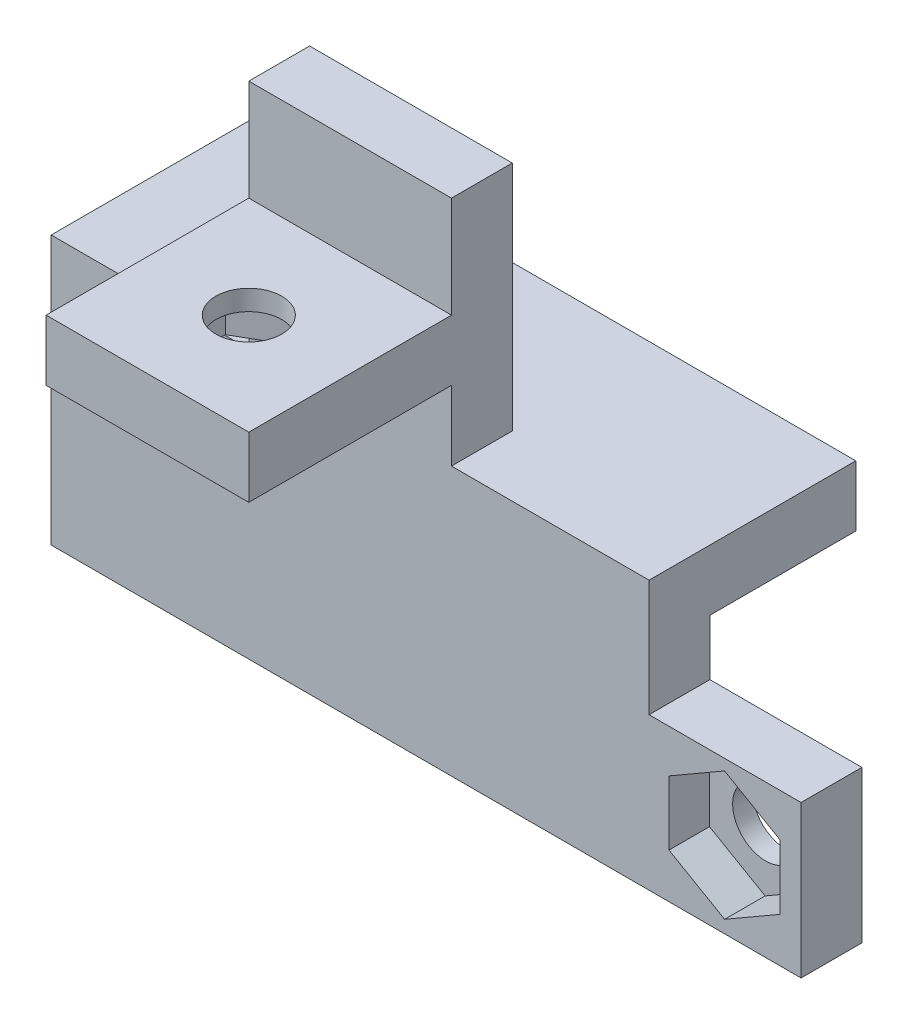
ISO-10303-21;
HEADER;
FILE_DESCRIPTION(('STEP AP214'),'2;1');
FILE_NAME('part.step','',(''),(''),'','','');
FILE_SCHEMA(('AUTOMOTIVE_DESIGN { 1 0 10303 214 1 1 1 1 }'));
ENDSEC;
DATA;
#1=APPLICATION_CONTEXT('core data for automotive mechanical design processes');
#2=APPLICATION_PROTOCOL_DEFINITION('international standard','automotive_design',2000,#1);
#3=PRODUCT_CONTEXT('',#1,'mechanical');
#4=PRODUCT('Part','Part','',(#3));
#5=PRODUCT_RELATED_PRODUCT_CATEGORY('part','',(#4));
#6=PRODUCT_DEFINITION_FORMATION('','',#4);
#7=PRODUCT_DEFINITION_CONTEXT('part definition',#1,'design');
#8=PRODUCT_DEFINITION('design','',#6,#7);
#9=PRODUCT_DEFINITION_SHAPE('','',#8);
#10=(LENGTH_UNIT() NAMED_UNIT(*) SI_UNIT(.MILLI.,.METRE.));
#11=(NAMED_UNIT(*) PLANE_ANGLE_UNIT() SI_UNIT($,.RADIAN.));
#12=(NAMED_UNIT(*) SI_UNIT($,.STERADIAN.) SOLID_ANGLE_UNIT());
#13=UNCERTAINTY_MEASURE_WITH_UNIT(LENGTH_MEASURE(1.E-05),#10,'distance_accuracy_value','');
#14=(GEOMETRIC_REPRESENTATION_CONTEXT(3) GLOBAL_UNCERTAINTY_ASSIGNED_CONTEXT((#13)) GLOBAL_UNIT_ASSIGNED_CONTEXT((#10,
#11,#12)) REPRESENTATION_CONTEXT('',''));
#15=CARTESIAN_POINT('',(0.,0.,0.));
#16=DIRECTION('',(0.,0.,1.));
#17=DIRECTION('',(1.,0.,0.));
#18=AXIS2_PLACEMENT_3D('',#15,#16,#17);
#19=CARTESIAN_POINT('',(-62.7088413646962,-5.00000000000036,8.));
#20=DIRECTION('',(0.,-1.,0.));
#21=DIRECTION('',(0.,0.,-1.));
#22=AXIS2_PLACEMENT_3D('',#19,#20,#21);
#23=CYLINDRICAL_SURFACE('',#22,1.625);
#24=CARTESIAN_POINT('',(-62.7088413646962,-5.00000000000036,8.));
#25=DIRECTION('',(0.,-1.,0.));
#26=DIRECTION('',(0.,0.,-1.));
#27=AXIS2_PLACEMENT_3D('',#24,#25,#26);
#28=CIRCLE('',#27,1.625);
#29=CARTESIAN_POINT('',(-62.7088413646962,-5.00000000000036,6.375));
#30=VERTEX_POINT('',#29);
#31=EDGE_CURVE('E274',#30,#30,#28,.T.);
#32=ORIENTED_EDGE('',*,*,#31,.F.);
#33=EDGE_LOOP('',(#32));
#34=FACE_BOUND('',#33,.T.);
#35=CARTESIAN_POINT('',(-62.7088413646962,-6.00000000000036,8.));
#36=DIRECTION('',(0.,-1.,0.));
#37=DIRECTION('',(0.,0.,-1.));
#38=AXIS2_PLACEMENT_3D('',#35,#36,#37);
#39=CIRCLE('',#38,1.625);
#40=CARTESIAN_POINT('',(-62.7088413646962,-6.00000000000036,6.375));
#41=VERTEX_POINT('',#40);
#42=EDGE_CURVE('E36',#41,#41,#39,.F.);
#43=ORIENTED_EDGE('',*,*,#42,.F.);
#44=EDGE_LOOP('',(#43));
#45=FACE_BOUND('',#44,.T.);
#46=ADVANCED_FACE('F32',(#34,#45),#23,.F.);
#47=CARTESIAN_POINT('',(0.,0.,3.));
#48=DIRECTION('',(0.,0.,1.));
#49=DIRECTION('',(1.,0.,0.));
#50=AXIS2_PLACEMENT_3D('',#47,#48,#49);
#51=PLANE('',#50);
#52=DIRECTION('',(1.,0.,0.));
#53=VECTOR('',#52,1.);
#54=CARTESIAN_POINT('',(-57.7088413646962,-8.00000000000036,3.));
#55=LINE('',#54,#53);
#56=CARTESIAN_POINT('',(-67.7088413646962,-8.00000000000036,3.));
#57=VERTEX_POINT('',#56);
#58=CARTESIAN_POINT('',(-57.7088413646962,-8.00000000000036,3.));
#59=VERTEX_POINT('',#58);
#60=EDGE_CURVE('E57',#57,#59,#55,.T.);
#61=ORIENTED_EDGE('',*,*,#60,.F.);
#62=DIRECTION('',(0.,-1.,0.));
#63=VECTOR('',#62,1.);
#64=CARTESIAN_POINT('',(-67.7088413646962,-5.00000000000036,3.));
#65=LINE('',#64,#63);
#66=CARTESIAN_POINT('',(-67.7088413646962,-11.4500000000005,3.));
#67=VERTEX_POINT('',#66);
#68=EDGE_CURVE('E327',#57,#67,#65,.T.);
#69=ORIENTED_EDGE('',*,*,#68,.T.);
#70=DIRECTION('',(1.,0.,0.));
#71=VECTOR('',#70,1.);
#72=CARTESIAN_POINT('',(-47.958841364696,-11.4500000000003,3.));
#73=LINE('',#72,#71);
#74=CARTESIAN_POINT('',(-77.4588413646964,-11.4500000000005,3.));
#75=VERTEX_POINT('',#74);
#76=EDGE_CURVE('E340',#75,#67,#73,.T.);
#77=ORIENTED_EDGE('',*,*,#76,.F.);
#78=DIRECTION('',(0.,-1.,0.));
#79=VECTOR('',#78,1.);
#80=CARTESIAN_POINT('',(-77.4588413646959,-24.7000000000005,3.));
#81=LINE('',#80,#79);
#82=CARTESIAN_POINT('',(-77.4588413646959,-24.7000000000005,3.));
#83=VERTEX_POINT('',#82);
#84=EDGE_CURVE('E420',#75,#83,#81,.T.);
#85=ORIENTED_EDGE('',*,*,#84,.T.);
#86=DIRECTION('',(1.,0.,0.));
#87=VECTOR('',#86,1.);
#88=CARTESIAN_POINT('',(-40.4588413646959,-24.7000000000014,3.));
#89=LINE('',#88,#87);
#90=CARTESIAN_POINT('',(-40.4588413646959,-24.7000000000014,3.));
#91=VERTEX_POINT('',#90);
#92=EDGE_CURVE('E422',#83,#91,#89,.T.);
#93=ORIENTED_EDGE('',*,*,#92,.T.);
#94=DIRECTION('',(0.,1.,0.));
#95=VECTOR('',#94,1.);
#96=CARTESIAN_POINT('',(-40.4588413646959,-24.7000000000014,3.));
#97=LINE('',#96,#95);
#98=CARTESIAN_POINT('',(-40.4588413646959,-17.2000000000014,3.));
#99=VERTEX_POINT('',#98);
#100=EDGE_CURVE('E411',#91,#99,#97,.T.);
#101=ORIENTED_EDGE('',*,*,#100,.T.);
#102=DIRECTION('',(-1.,0.,0.));
#103=VECTOR('',#102,1.);
#104=CARTESIAN_POINT('',(-40.4588413646959,-17.2000000000014,3.));
#105=LINE('',#104,#103);
#106=CARTESIAN_POINT('',(-47.958841364696,-17.2000000000014,3.));
#107=VERTEX_POINT('',#106);
#108=EDGE_CURVE('E414',#99,#107,#105,.T.);
#109=ORIENTED_EDGE('',*,*,#108,.T.);
#110=DIRECTION('',(0.,1.,0.));
#111=VECTOR('',#110,1.);
#112=CARTESIAN_POINT('',(-47.958841364696,-17.2000000000014,3.));
#113=LINE('',#112,#111);
#114=CARTESIAN_POINT('',(-47.958841364696,-11.4500000000003,3.));
#115=VERTEX_POINT('',#114);
#116=EDGE_CURVE('E417',#107,#115,#113,.T.);
#117=ORIENTED_EDGE('',*,*,#116,.T.);
#118=CARTESIAN_POINT('',(-57.7088413646962,-11.4500000000004,3.));
#119=VERTEX_POINT('',#118);
#120=EDGE_CURVE('E338',#119,#115,#73,.T.);
#121=ORIENTED_EDGE('',*,*,#120,.F.);
#122=DIRECTION('',(0.,1.,0.));
#123=VECTOR('',#122,1.);
#124=CARTESIAN_POINT('',(-57.7088413646962,-11.4500000000005,3.));
#125=LINE('',#124,#123);
#126=EDGE_CURVE('E325',#119,#59,#125,.T.);
#127=ORIENTED_EDGE('',*,*,#126,.T.);
#128=EDGE_LOOP('',(#61,#69,#77,#85,#93,#101,#109,#117,#121,#127));
#129=FACE_BOUND('',#128,.T.);
#130=DIRECTION('',(-0.866025403784438,0.500000000000001,0.));
#131=VECTOR('',#130,1.);
#132=CARTESIAN_POINT('',(-41.4871923916485,-19.3240343016862,3.));
#133=LINE('',#132,#131);
#134=CARTESIAN_POINT('',(-41.4871923916485,-19.3240343016862,3.));
#135=VERTEX_POINT('',#134);
#136=CARTESIAN_POINT('',(-44.2324929216451,-17.7390343016861,3.));
#137=VERTEX_POINT('',#136);
#138=EDGE_CURVE('E358',#135,#137,#133,.T.);
#139=ORIENTED_EDGE('',*,*,#138,.F.);
#140=DIRECTION('',(0.,1.,0.));
#141=VECTOR('',#140,1.);
#142=CARTESIAN_POINT('',(-41.4871923916485,-22.4940343016861,3.));
#143=LINE('',#142,#141);
#144=CARTESIAN_POINT('',(-41.4871923916485,-22.4940343016861,3.));
#145=VERTEX_POINT('',#144);
#146=EDGE_CURVE('E363',#145,#135,#143,.T.);
#147=ORIENTED_EDGE('',*,*,#146,.F.);
#148=DIRECTION('',(0.866025403784439,0.5,0.));
#149=VECTOR('',#148,1.);
#150=CARTESIAN_POINT('',(-44.2324929216451,-24.0790343016861,3.));
#151=LINE('',#150,#149);
#152=CARTESIAN_POINT('',(-44.2324929216451,-24.0790343016861,3.));
#153=VERTEX_POINT('',#152);
#154=EDGE_CURVE('E389',#153,#145,#151,.T.);
#155=ORIENTED_EDGE('',*,*,#154,.F.);
#156=DIRECTION('',(0.866025403784439,-0.5,0.));
#157=VECTOR('',#156,1.);
#158=CARTESIAN_POINT('',(-46.9777934516418,-22.4940343016861,3.));
#159=LINE('',#158,#157);
#160=CARTESIAN_POINT('',(-46.9777934516418,-22.4940343016861,3.));
#161=VERTEX_POINT('',#160);
#162=EDGE_CURVE('E386',#161,#153,#159,.T.);
#163=ORIENTED_EDGE('',*,*,#162,.F.);
#164=DIRECTION('',(0.,-1.,0.));
#165=VECTOR('',#164,1.);
#166=CARTESIAN_POINT('',(-46.9777934516418,-19.3240343016861,3.));
#167=LINE('',#166,#165);
#168=CARTESIAN_POINT('',(-46.9777934516418,-19.3240343016861,3.));
#169=VERTEX_POINT('',#168);
#170=EDGE_CURVE('E383',#169,#161,#167,.T.);
#171=ORIENTED_EDGE('',*,*,#170,.F.);
#172=DIRECTION('',(-0.86602540378444,-0.499999999999998,0.));
#173=VECTOR('',#172,1.);
#174=CARTESIAN_POINT('',(-44.2324929216451,-17.7390343016862,3.));
#175=LINE('',#174,#173);
#176=EDGE_CURVE('E380',#137,#169,#175,.T.);
#177=ORIENTED_EDGE('',*,*,#176,.F.);
#178=EDGE_LOOP('',(#139,#147,#155,#163,#171,#177));
#179=FACE_BOUND('',#178,.T.);
#180=ADVANCED_FACE('F478',(#129,#179),#51,.T.);
#181=CARTESIAN_POINT('',(-44.2088413646959,-20.9500000000014,3.));
#182=DIRECTION('',(0.,0.,-1.));
#183=DIRECTION('',(-1.,0.,0.));
#184=AXIS2_PLACEMENT_3D('',#181,#182,#183);
#185=CYLINDRICAL_SURFACE('',#184,1.62500000000032);
#186=CARTESIAN_POINT('',(-44.2088413646959,-20.9500000000014,0.));
#187=DIRECTION('',(0.,0.,1.));
#188=DIRECTION('',(1.,0.,0.));
#189=AXIS2_PLACEMENT_3D('',#186,#187,#188);
#190=CIRCLE('',#189,1.62500000000032);
#191=CARTESIAN_POINT('',(-42.5838413646956,-20.9500000000014,0.));
#192=VERTEX_POINT('',#191);
#193=EDGE_CURVE('E407',#192,#192,#190,.T.);
#194=ORIENTED_EDGE('',*,*,#193,.F.);
#195=EDGE_LOOP('',(#194));
#196=FACE_BOUND('',#195,.T.);
#197=CARTESIAN_POINT('',(-44.2088413646959,-20.9500000000014,1.));
#198=DIRECTION('',(0.,0.,1.));
#199=DIRECTION('',(1.,0.,0.));
#200=AXIS2_PLACEMENT_3D('',#197,#198,#199);
#201=CIRCLE('',#200,1.62500000000032);
#202=CARTESIAN_POINT('',(-42.5838413646956,-20.9500000000014,1.));
#203=VERTEX_POINT('',#202);
#204=EDGE_CURVE('E396',#203,#203,#201,.T.);
#205=ORIENTED_EDGE('',*,*,#204,.T.);
#206=EDGE_LOOP('',(#205));
#207=FACE_BOUND('',#206,.T.);
#208=ADVANCED_FACE('F446',(#196,#207),#185,.F.);
#209=DIRECTION('',(-1.,0.,0.));
#210=VECTOR('',#209,1.);
#211=CARTESIAN_POINT('',(-67.7088413646962,-5.00000000000036,3.));
#212=LINE('',#211,#210);
#213=CARTESIAN_POINT('',(-57.7088413646962,-5.00000000000036,3.));
#214=VERTEX_POINT('',#213);
#215=CARTESIAN_POINT('',(-67.7088413646962,-5.00000000000036,3.));
#216=VERTEX_POINT('',#215);
#217=EDGE_CURVE('E281',#214,#216,#212,.T.);
#218=ORIENTED_EDGE('',*,*,#217,.F.);
#219=CARTESIAN_POINT('',(-57.7088413646962,0.,3.));
#220=VERTEX_POINT('',#219);
#221=EDGE_CURVE('E314',#214,#220,#125,.T.);
#222=ORIENTED_EDGE('',*,*,#221,.T.);
#223=DIRECTION('',(1.,0.,0.));
#224=VECTOR('',#223,1.);
#225=CARTESIAN_POINT('',(-67.7088413646962,0.,3.));
#226=LINE('',#225,#224);
#227=CARTESIAN_POINT('',(-67.7088413646962,0.,3.));
#228=VERTEX_POINT('',#227);
#229=EDGE_CURVE('E305',#228,#220,#226,.T.);
#230=ORIENTED_EDGE('',*,*,#229,.F.);
#231=EDGE_CURVE('E319',#228,#216,#65,.T.);
#232=ORIENTED_EDGE('',*,*,#231,.T.);
#233=EDGE_LOOP('',(#218,#222,#230,#232));
#234=FACE_BOUND('',#233,.T.);
#235=ADVANCED_FACE('F481',(#234),#51,.T.);
#236=CARTESIAN_POINT('',(0.,0.,0.));
#237=DIRECTION('',(0.,0.,1.));
#238=DIRECTION('',(1.,0.,0.));
#239=AXIS2_PLACEMENT_3D('',#236,#237,#238);
#240=PLANE('',#239);
#241=DIRECTION('',(0.,1.,0.));
#242=VECTOR('',#241,1.);
#243=CARTESIAN_POINT('',(-40.4588413646959,-24.7000000000014,0.));
#244=LINE('',#243,#242);
#245=CARTESIAN_POINT('',(-40.4588413646959,-24.7000000000014,0.));
#246=VERTEX_POINT('',#245);
#247=CARTESIAN_POINT('',(-40.4588413646959,-17.2000000000014,0.));
#248=VERTEX_POINT('',#247);
#249=EDGE_CURVE('E410',#246,#248,#244,.T.);
#250=ORIENTED_EDGE('',*,*,#249,.F.);
#251=DIRECTION('',(1.,0.,0.));
#252=VECTOR('',#251,1.);
#253=CARTESIAN_POINT('',(-40.4588413646959,-24.7000000000014,0.));
#254=LINE('',#253,#252);
#255=CARTESIAN_POINT('',(-77.4588413646959,-24.7000000000005,0.));
#256=VERTEX_POINT('',#255);
#257=EDGE_CURVE('E415',#256,#246,#254,.T.);
#258=ORIENTED_EDGE('',*,*,#257,.F.);
#259=DIRECTION('',(0.,-1.,0.));
#260=VECTOR('',#259,1.);
#261=CARTESIAN_POINT('',(-77.4588413646959,-24.7000000000005,0.));
#262=LINE('',#261,#260);
#263=CARTESIAN_POINT('',(-77.4588413646964,-14.4500000000005,0.));
#264=VERTEX_POINT('',#263);
#265=EDGE_CURVE('E434',#264,#256,#262,.T.);
#266=ORIENTED_EDGE('',*,*,#265,.F.);
#267=DIRECTION('',(-1.,0.,0.));
#268=VECTOR('',#267,1.);
#269=CARTESIAN_POINT('',(-77.458841364696,-14.4500000000005,0.));
#270=LINE('',#269,#268);
#271=CARTESIAN_POINT('',(-47.958841364696,-14.4500000000003,0.));
#272=VERTEX_POINT('',#271);
#273=EDGE_CURVE('E431',#272,#264,#270,.T.);
#274=ORIENTED_EDGE('',*,*,#273,.F.);
#275=DIRECTION('',(0.,1.,0.));
#276=VECTOR('',#275,1.);
#277=CARTESIAN_POINT('',(-47.958841364696,-17.2000000000014,0.));
#278=LINE('',#277,#276);
#279=CARTESIAN_POINT('',(-47.958841364696,-17.2000000000014,0.));
#280=VERTEX_POINT('',#279);
#281=EDGE_CURVE('E429',#280,#272,#278,.T.);
#282=ORIENTED_EDGE('',*,*,#281,.F.);
#283=DIRECTION('',(-1.,0.,0.));
#284=VECTOR('',#283,1.);
#285=CARTESIAN_POINT('',(-40.4588413646959,-17.2000000000014,0.));
#286=LINE('',#285,#284);
#287=EDGE_CURVE('E427',#248,#280,#286,.T.);
#288=ORIENTED_EDGE('',*,*,#287,.F.);
#289=EDGE_LOOP('',(#250,#258,#266,#274,#282,#288));
#290=FACE_BOUND('',#289,.T.);
#291=ORIENTED_EDGE('',*,*,#193,.T.);
#292=EDGE_LOOP('',(#291));
#293=FACE_BOUND('',#292,.T.);
#294=ADVANCED_FACE('F492',(#290,#293),#240,.F.);
#295=CARTESIAN_POINT('',(-40.4588413646959,-24.7000000000014,3.));
#296=DIRECTION('',(-1.,0.,0.));
#297=DIRECTION('',(0.,0.,1.));
#298=AXIS2_PLACEMENT_3D('',#295,#296,#297);
#299=PLANE('',#298);
#300=ORIENTED_EDGE('',*,*,#249,.T.);
#301=DIRECTION('',(0.,0.,-1.));
#302=VECTOR('',#301,1.);
#303=CARTESIAN_POINT('',(-40.4588413646959,-17.2000000000014,3.));
#304=LINE('',#303,#302);
#305=EDGE_CURVE('E11',#99,#248,#304,.T.);
#306=ORIENTED_EDGE('',*,*,#305,.F.);
#307=ORIENTED_EDGE('',*,*,#100,.F.);
#308=DIRECTION('',(0.,0.,-1.));
#309=VECTOR('',#308,1.);
#310=CARTESIAN_POINT('',(-40.4588413646959,-24.7000000000014,3.));
#311=LINE('',#310,#309);
#312=EDGE_CURVE('E424',#91,#246,#311,.T.);
#313=ORIENTED_EDGE('',*,*,#312,.T.);
#314=EDGE_LOOP('',(#300,#306,#307,#313));
#315=FACE_BOUND('',#314,.T.);
#316=ADVANCED_FACE('F34',(#315),#299,.F.);
#317=CARTESIAN_POINT('',(-40.4588413646959,-17.2000000000014,3.));
#318=DIRECTION('',(0.,-1.,0.));
#319=DIRECTION('',(0.,0.,-1.));
#320=AXIS2_PLACEMENT_3D('',#317,#318,#319);
#321=PLANE('',#320);
#322=ORIENTED_EDGE('',*,*,#287,.T.);
#323=DIRECTION('',(0.,0.,-1.));
#324=VECTOR('',#323,1.);
#325=CARTESIAN_POINT('',(-47.958841364696,-17.2000000000014,3.));
#326=LINE('',#325,#324);
#327=EDGE_CURVE('E41',#107,#280,#326,.T.);
#328=ORIENTED_EDGE('',*,*,#327,.F.);
#329=ORIENTED_EDGE('',*,*,#108,.F.);
#330=ORIENTED_EDGE('',*,*,#305,.T.);
#331=EDGE_LOOP('',(#322,#328,#329,#330));
#332=FACE_BOUND('',#331,.T.);
#333=ADVANCED_FACE('F540',(#332),#321,.F.);
#334=CARTESIAN_POINT('',(-47.958841364696,-17.2000000000014,3.));
#335=DIRECTION('',(-1.,0.,0.));
#336=DIRECTION('',(0.,0.,1.));
#337=AXIS2_PLACEMENT_3D('',#334,#335,#336);
#338=PLANE('',#337);
#339=ORIENTED_EDGE('',*,*,#281,.T.);
#340=DIRECTION('',(0.,0.,-1.));
#341=VECTOR('',#340,1.);
#342=CARTESIAN_POINT('',(-47.958841364696,-14.4500000000003,3.));
#343=LINE('',#342,#341);
#344=CARTESIAN_POINT('',(-47.958841364696,-14.4500000000003,-7.2));
#345=VERTEX_POINT('',#344);
#346=EDGE_CURVE('E350',#272,#345,#343,.T.);
#347=ORIENTED_EDGE('',*,*,#346,.T.);
#348=DIRECTION('',(0.,-1.,0.));
#349=VECTOR('',#348,1.);
#350=CARTESIAN_POINT('',(-47.958841364696,-11.4500000000003,-7.2));
#351=LINE('',#350,#349);
#352=CARTESIAN_POINT('',(-47.958841364696,-11.4500000000003,-7.2));
#353=VERTEX_POINT('',#352);
#354=EDGE_CURVE('E355',#353,#345,#351,.T.);
#355=ORIENTED_EDGE('',*,*,#354,.F.);
#356=DIRECTION('',(0.,0.,-1.));
#357=VECTOR('',#356,1.);
#358=CARTESIAN_POINT('',(-47.958841364696,-11.4500000000003,3.));
#359=LINE('',#358,#357);
#360=EDGE_CURVE('E343',#115,#353,#359,.T.);
#361=ORIENTED_EDGE('',*,*,#360,.F.);
#362=ORIENTED_EDGE('',*,*,#116,.F.);
#363=ORIENTED_EDGE('',*,*,#327,.T.);
#364=EDGE_LOOP('',(#339,#347,#355,#361,#362,#363));
#365=FACE_BOUND('',#364,.T.);
#366=ADVANCED_FACE('F545',(#365),#338,.F.);
#367=CARTESIAN_POINT('',(-77.4588413646959,-24.7000000000005,3.));
#368=DIRECTION('',(1.,0.,0.));
#369=DIRECTION('',(0.,1.,0.));
#370=AXIS2_PLACEMENT_3D('',#367,#368,#369);
#371=PLANE('',#370);
#372=ORIENTED_EDGE('',*,*,#265,.T.);
#373=DIRECTION('',(0.,0.,-1.));
#374=VECTOR('',#373,1.);
#375=CARTESIAN_POINT('',(-77.4588413646959,-24.7000000000005,3.));
#376=LINE('',#375,#374);
#377=EDGE_CURVE('E439',#83,#256,#376,.T.);
#378=ORIENTED_EDGE('',*,*,#377,.F.);
#379=ORIENTED_EDGE('',*,*,#84,.F.);
#380=DIRECTION('',(0.,0.,1.));
#381=VECTOR('',#380,1.);
#382=CARTESIAN_POINT('',(-77.4588413646964,-11.4500000000005,3.));
#383=LINE('',#382,#381);
#384=CARTESIAN_POINT('',(-77.4588413646964,-11.4500000000005,-7.2));
#385=VERTEX_POINT('',#384);
#386=EDGE_CURVE('E335',#385,#75,#383,.T.);
#387=ORIENTED_EDGE('',*,*,#386,.F.);
#388=DIRECTION('',(0.,-1.,0.));
#389=VECTOR('',#388,1.);
#390=CARTESIAN_POINT('',(-77.4588413646964,-11.4500000000005,-7.2));
#391=LINE('',#390,#389);
#392=CARTESIAN_POINT('',(-77.4588413646964,-14.4500000000005,-7.2));
#393=VERTEX_POINT('',#392);
#394=EDGE_CURVE('E347',#385,#393,#391,.T.);
#395=ORIENTED_EDGE('',*,*,#394,.T.);
#396=DIRECTION('',(0.,0.,1.));
#397=VECTOR('',#396,1.);
#398=CARTESIAN_POINT('',(-77.4588413646964,-14.4500000000005,3.));
#399=LINE('',#398,#397);
#400=EDGE_CURVE('E332',#393,#264,#399,.T.);
#401=ORIENTED_EDGE('',*,*,#400,.T.);
#402=EDGE_LOOP('',(#372,#378,#379,#387,#395,#401));
#403=FACE_BOUND('',#402,.T.);
#404=ADVANCED_FACE('F527',(#403),#371,.F.);
#405=CARTESIAN_POINT('',(-40.4588413646959,-24.7000000000014,3.));
#406=DIRECTION('',(0.,1.,0.));
#407=DIRECTION('',(-1.,0.,0.));
#408=AXIS2_PLACEMENT_3D('',#405,#406,#407);
#409=PLANE('',#408);
#410=ORIENTED_EDGE('',*,*,#257,.T.);
#411=ORIENTED_EDGE('',*,*,#312,.F.);
#412=ORIENTED_EDGE('',*,*,#92,.F.);
#413=ORIENTED_EDGE('',*,*,#377,.T.);
#414=EDGE_LOOP('',(#410,#411,#412,#413));
#415=FACE_BOUND('',#414,.T.);
#416=ADVANCED_FACE('F533',(#415),#409,.F.);
#417=CARTESIAN_POINT('',(-41.4871923916485,-19.3240343016862,1.));
#418=DIRECTION('',(0.500000000000001,0.866025403784438,0.));
#419=DIRECTION('',(-0.866025403784438,0.500000000000001,0.));
#420=AXIS2_PLACEMENT_3D('',#417,#418,#419);
#421=PLANE('',#420);
#422=ORIENTED_EDGE('',*,*,#138,.T.);
#423=DIRECTION('',(0.,0.,1.));
#424=VECTOR('',#423,1.);
#425=CARTESIAN_POINT('',(-44.2324929216451,-17.7390343016862,1.));
#426=LINE('',#425,#424);
#427=CARTESIAN_POINT('',(-44.2324929216451,-17.7390343016862,1.));
#428=VERTEX_POINT('',#427);
#429=EDGE_CURVE('E378',#428,#137,#426,.T.);
#430=ORIENTED_EDGE('',*,*,#429,.F.);
#431=DIRECTION('',(-0.866025403784438,0.500000000000001,0.));
#432=VECTOR('',#431,1.);
#433=CARTESIAN_POINT('',(-41.4871923916485,-19.3240343016862,1.));
#434=LINE('',#433,#432);
#435=CARTESIAN_POINT('',(-41.4871923916485,-19.3240343016862,1.));
#436=VERTEX_POINT('',#435);
#437=EDGE_CURVE('E359',#436,#428,#434,.T.);
#438=ORIENTED_EDGE('',*,*,#437,.F.);
#439=DIRECTION('',(0.,0.,1.));
#440=VECTOR('',#439,1.);
#441=CARTESIAN_POINT('',(-41.4871923916485,-19.3240343016862,1.));
#442=LINE('',#441,#440);
#443=EDGE_CURVE('E394',#436,#135,#442,.T.);
#444=ORIENTED_EDGE('',*,*,#443,.T.);
#445=EDGE_LOOP('',(#422,#430,#438,#444));
#446=FACE_BOUND('',#445,.T.);
#447=ADVANCED_FACE('F458',(#446),#421,.F.);
#448=CARTESIAN_POINT('',(-41.4871923916485,-22.4940343016861,1.));
#449=DIRECTION('',(1.,0.,0.));
#450=DIRECTION('',(0.,0.,-1.));
#451=AXIS2_PLACEMENT_3D('',#448,#449,#450);
#452=PLANE('',#451);
#453=ORIENTED_EDGE('',*,*,#146,.T.);
#454=ORIENTED_EDGE('',*,*,#443,.F.);
#455=DIRECTION('',(0.,1.,0.));
#456=VECTOR('',#455,1.);
#457=CARTESIAN_POINT('',(-41.4871923916485,-22.4940343016861,1.));
#458=LINE('',#457,#456);
#459=CARTESIAN_POINT('',(-41.4871923916485,-22.4940343016861,1.));
#460=VERTEX_POINT('',#459);
#461=EDGE_CURVE('E375',#460,#436,#458,.T.);
#462=ORIENTED_EDGE('',*,*,#461,.F.);
#463=DIRECTION('',(0.,0.,1.));
#464=VECTOR('',#463,1.);
#465=CARTESIAN_POINT('',(-41.4871923916485,-22.4940343016861,1.));
#466=LINE('',#465,#464);
#467=EDGE_CURVE('E397',#460,#145,#466,.T.);
#468=ORIENTED_EDGE('',*,*,#467,.T.);
#469=EDGE_LOOP('',(#453,#454,#462,#468));
#470=FACE_BOUND('',#469,.T.);
#471=ADVANCED_FACE('F476',(#470),#452,.F.);
#472=CARTESIAN_POINT('',(-44.2324929216451,-24.0790343016861,1.));
#473=DIRECTION('',(0.5,-0.866025403784439,0.));
#474=DIRECTION('',(0.866025403784439,0.5,0.));
#475=AXIS2_PLACEMENT_3D('',#472,#473,#474);
#476=PLANE('',#475);
#477=ORIENTED_EDGE('',*,*,#154,.T.);
#478=ORIENTED_EDGE('',*,*,#467,.F.);
#479=DIRECTION('',(0.866025403784439,0.5,0.));
#480=VECTOR('',#479,1.);
#481=CARTESIAN_POINT('',(-44.2324929216451,-24.0790343016861,1.));
#482=LINE('',#481,#480);
#483=CARTESIAN_POINT('',(-44.2324929216451,-24.0790343016861,1.));
#484=VERTEX_POINT('',#483);
#485=EDGE_CURVE('E372',#484,#460,#482,.T.);
#486=ORIENTED_EDGE('',*,*,#485,.F.);
#487=DIRECTION('',(0.,0.,1.));
#488=VECTOR('',#487,1.);
#489=CARTESIAN_POINT('',(-44.2324929216451,-24.0790343016861,1.));
#490=LINE('',#489,#488);
#491=EDGE_CURVE('E399',#484,#153,#490,.T.);
#492=ORIENTED_EDGE('',*,*,#491,.T.);
#493=EDGE_LOOP('',(#477,#478,#486,#492));
#494=FACE_BOUND('',#493,.T.);
#495=ADVANCED_FACE('F473',(#494),#476,.F.);
#496=CARTESIAN_POINT('',(-46.9777934516418,-22.4940343016861,1.));
#497=DIRECTION('',(-0.5,-0.866025403784439,0.));
#498=DIRECTION('',(0.866025403784439,-0.5,0.));
#499=AXIS2_PLACEMENT_3D('',#496,#497,#498);
#500=PLANE('',#499);
#501=ORIENTED_EDGE('',*,*,#162,.T.);
#502=ORIENTED_EDGE('',*,*,#491,.F.);
#503=DIRECTION('',(0.866025403784439,-0.5,0.));
#504=VECTOR('',#503,1.);
#505=CARTESIAN_POINT('',(-46.9777934516418,-22.4940343016861,1.));
#506=LINE('',#505,#504);
#507=CARTESIAN_POINT('',(-46.9777934516418,-22.4940343016861,1.));
#508=VERTEX_POINT('',#507);
#509=EDGE_CURVE('E369',#508,#484,#506,.T.);
#510=ORIENTED_EDGE('',*,*,#509,.F.);
#511=DIRECTION('',(0.,0.,1.));
#512=VECTOR('',#511,1.);
#513=CARTESIAN_POINT('',(-46.9777934516418,-22.4940343016861,1.));
#514=LINE('',#513,#512);
#515=EDGE_CURVE('E401',#508,#161,#514,.T.);
#516=ORIENTED_EDGE('',*,*,#515,.T.);
#517=EDGE_LOOP('',(#501,#502,#510,#516));
#518=FACE_BOUND('',#517,.T.);
#519=ADVANCED_FACE('F469',(#518),#500,.F.);
#520=CARTESIAN_POINT('',(-46.9777934516418,-19.3240343016861,1.));
#521=DIRECTION('',(-1.,0.,0.));
#522=DIRECTION('',(0.,0.,1.));
#523=AXIS2_PLACEMENT_3D('',#520,#521,#522);
#524=PLANE('',#523);
#525=ORIENTED_EDGE('',*,*,#170,.T.);
#526=ORIENTED_EDGE('',*,*,#515,.F.);
#527=DIRECTION('',(0.,-1.,0.));
#528=VECTOR('',#527,1.);
#529=CARTESIAN_POINT('',(-46.9777934516418,-19.3240343016861,1.));
#530=LINE('',#529,#528);
#531=CARTESIAN_POINT('',(-46.9777934516418,-19.3240343016861,1.));
#532=VERTEX_POINT('',#531);
#533=EDGE_CURVE('E366',#532,#508,#530,.T.);
#534=ORIENTED_EDGE('',*,*,#533,.F.);
#535=DIRECTION('',(0.,0.,1.));
#536=VECTOR('',#535,1.);
#537=CARTESIAN_POINT('',(-46.9777934516418,-19.3240343016861,1.));
#538=LINE('',#537,#536);
#539=EDGE_CURVE('E403',#532,#169,#538,.T.);
#540=ORIENTED_EDGE('',*,*,#539,.T.);
#541=EDGE_LOOP('',(#525,#526,#534,#540));
#542=FACE_BOUND('',#541,.T.);
#543=ADVANCED_FACE('F465',(#542),#524,.F.);
#544=CARTESIAN_POINT('',(-44.2324929216451,-17.7390343016862,1.));
#545=DIRECTION('',(-0.499999999999998,0.86602540378444,0.));
#546=DIRECTION('',(-0.86602540378444,-0.499999999999998,0.));
#547=AXIS2_PLACEMENT_3D('',#544,#545,#546);
#548=PLANE('',#547);
#549=ORIENTED_EDGE('',*,*,#176,.T.);
#550=ORIENTED_EDGE('',*,*,#539,.F.);
#551=DIRECTION('',(-0.86602540378444,-0.499999999999998,0.));
#552=VECTOR('',#551,1.);
#553=CARTESIAN_POINT('',(-44.2324929216451,-17.7390343016862,1.));
#554=LINE('',#553,#552);
#555=EDGE_CURVE('E362',#428,#532,#554,.T.);
#556=ORIENTED_EDGE('',*,*,#555,.F.);
#557=ORIENTED_EDGE('',*,*,#429,.T.);
#558=EDGE_LOOP('',(#549,#550,#556,#557));
#559=FACE_BOUND('',#558,.T.);
#560=ADVANCED_FACE('F452',(#559),#548,.F.);
#561=CARTESIAN_POINT('',(0.,0.,1.));
#562=DIRECTION('',(0.,0.,1.));
#563=DIRECTION('',(1.,0.,0.));
#564=AXIS2_PLACEMENT_3D('',#561,#562,#563);
#565=PLANE('',#564);
#566=ORIENTED_EDGE('',*,*,#204,.F.);
#567=EDGE_LOOP('',(#566));
#568=FACE_BOUND('',#567,.T.);
#569=ORIENTED_EDGE('',*,*,#437,.T.);
#570=ORIENTED_EDGE('',*,*,#555,.T.);
#571=ORIENTED_EDGE('',*,*,#533,.T.);
#572=ORIENTED_EDGE('',*,*,#509,.T.);
#573=ORIENTED_EDGE('',*,*,#485,.T.);
#574=ORIENTED_EDGE('',*,*,#461,.T.);
#575=EDGE_LOOP('',(#569,#570,#571,#572,#573,#574));
#576=FACE_BOUND('',#575,.T.);
#577=ADVANCED_FACE('F448',(#568,#576),#565,.T.);
#578=CARTESIAN_POINT('',(1.00267016911458E-13,-14.45,0.));
#579=DIRECTION('',(0.,1.,0.));
#580=DIRECTION('',(-1.,0.,0.));
#581=AXIS2_PLACEMENT_3D('',#578,#579,#580);
#582=PLANE('',#581);
#583=ORIENTED_EDGE('',*,*,#346,.F.);
#584=ORIENTED_EDGE('',*,*,#273,.T.);
#585=ORIENTED_EDGE('',*,*,#400,.F.);
#586=DIRECTION('',(-1.,0.,0.));
#587=VECTOR('',#586,1.);
#588=CARTESIAN_POINT('',(-47.958841364696,-14.4500000000003,-7.2));
#589=LINE('',#588,#587);
#590=EDGE_CURVE('E339',#345,#393,#589,.T.);
#591=ORIENTED_EDGE('',*,*,#590,.F.);
#592=EDGE_LOOP('',(#583,#584,#585,#591));
#593=FACE_BOUND('',#592,.T.);
#594=ADVANCED_FACE('F451',(#593),#582,.F.);
#595=CARTESIAN_POINT('',(-47.958841364696,-11.4500000000003,-7.2));
#596=DIRECTION('',(0.,0.,1.));
#597=DIRECTION('',(1.,0.,0.));
#598=AXIS2_PLACEMENT_3D('',#595,#596,#597);
#599=PLANE('',#598);
#600=ORIENTED_EDGE('',*,*,#590,.T.);
#601=ORIENTED_EDGE('',*,*,#394,.F.);
#602=DIRECTION('',(-1.,0.,0.));
#603=VECTOR('',#602,1.);
#604=CARTESIAN_POINT('',(-47.958841364696,-11.4500000000003,-7.2));
#605=LINE('',#604,#603);
#606=EDGE_CURVE('E345',#353,#385,#605,.T.);
#607=ORIENTED_EDGE('',*,*,#606,.F.);
#608=ORIENTED_EDGE('',*,*,#354,.T.);
#609=EDGE_LOOP('',(#600,#601,#607,#608));
#610=FACE_BOUND('',#609,.T.);
#611=ADVANCED_FACE('F572',(#610),#599,.F.);
#612=CARTESIAN_POINT('',(0.,-11.45,0.));
#613=DIRECTION('',(0.,1.,0.));
#614=DIRECTION('',(-1.,0.,0.));
#615=AXIS2_PLACEMENT_3D('',#612,#613,#614);
#616=PLANE('',#615);
#617=DIRECTION('',(0.,0.,1.));
#618=VECTOR('',#617,1.);
#619=CARTESIAN_POINT('',(-67.7088413646962,-11.4500000000005,0.));
#620=LINE('',#619,#618);
#621=CARTESIAN_POINT('',(-67.7088413646962,-11.4500000000005,0.));
#622=VERTEX_POINT('',#621);
#623=EDGE_CURVE('E329',#622,#67,#620,.T.);
#624=ORIENTED_EDGE('',*,*,#623,.F.);
#625=DIRECTION('',(1.,0.,0.));
#626=VECTOR('',#625,1.);
#627=CARTESIAN_POINT('',(-62.7088413646962,-11.4500000000004,0.));
#628=LINE('',#627,#626);
#629=CARTESIAN_POINT('',(-57.7088413646962,-11.4500000000005,0.));
#630=VERTEX_POINT('',#629);
#631=EDGE_CURVE('E315',#622,#630,#628,.T.);
#632=ORIENTED_EDGE('',*,*,#631,.T.);
#633=DIRECTION('',(0.,0.,1.));
#634=VECTOR('',#633,1.);
#635=CARTESIAN_POINT('',(-57.7088413646962,-11.4500000000005,0.));
#636=LINE('',#635,#634);
#637=EDGE_CURVE('E324',#630,#119,#636,.T.);
#638=ORIENTED_EDGE('',*,*,#637,.T.);
#639=ORIENTED_EDGE('',*,*,#120,.T.);
#640=ORIENTED_EDGE('',*,*,#360,.T.);
#641=ORIENTED_EDGE('',*,*,#606,.T.);
#642=ORIENTED_EDGE('',*,*,#386,.T.);
#643=ORIENTED_EDGE('',*,*,#76,.T.);
#644=EDGE_LOOP('',(#624,#632,#638,#639,#640,#641,#642,#643));
#645=FACE_BOUND('',#644,.T.);
#646=ADVANCED_FACE('F523',(#645),#616,.T.);
#647=CARTESIAN_POINT('',(-67.7088413646962,-5.00000000000036,0.));
#648=DIRECTION('',(-1.,0.,0.));
#649=DIRECTION('',(0.,0.,1.));
#650=AXIS2_PLACEMENT_3D('',#647,#648,#649);
#651=PLANE('',#650);
#652=ORIENTED_EDGE('',*,*,#231,.F.);
#653=DIRECTION('',(0.,0.,1.));
#654=VECTOR('',#653,1.);
#655=CARTESIAN_POINT('',(-67.7088413646962,0.,0.));
#656=LINE('',#655,#654);
#657=CARTESIAN_POINT('',(-67.7088413646962,0.,0.));
#658=VERTEX_POINT('',#657);
#659=EDGE_CURVE('E302',#658,#228,#656,.T.);
#660=ORIENTED_EDGE('',*,*,#659,.F.);
#661=DIRECTION('',(0.,-1.,0.));
#662=VECTOR('',#661,1.);
#663=CARTESIAN_POINT('',(-67.7088413646962,-5.00000000000036,0.));
#664=LINE('',#663,#662);
#665=EDGE_CURVE('E321',#658,#622,#664,.T.);
#666=ORIENTED_EDGE('',*,*,#665,.T.);
#667=ORIENTED_EDGE('',*,*,#623,.T.);
#668=ORIENTED_EDGE('',*,*,#68,.F.);
#669=DIRECTION('',(0.,0.,-1.));
#670=VECTOR('',#669,1.);
#671=CARTESIAN_POINT('',(-67.7088413646962,-8.00000000000036,13.));
#672=LINE('',#671,#670);
#673=CARTESIAN_POINT('',(-67.7088413646962,-8.00000000000036,13.));
#674=VERTEX_POINT('',#673);
#675=EDGE_CURVE('E287',#674,#57,#672,.T.);
#676=ORIENTED_EDGE('',*,*,#675,.F.);
#677=DIRECTION('',(0.,-1.,0.));
#678=VECTOR('',#677,1.);
#679=CARTESIAN_POINT('',(-67.7088413646962,-8.00000000000036,13.));
#680=LINE('',#679,#678);
#681=CARTESIAN_POINT('',(-67.7088413646962,-5.00000000000036,13.));
#682=VERTEX_POINT('',#681);
#683=EDGE_CURVE('E285',#682,#674,#680,.T.);
#684=ORIENTED_EDGE('',*,*,#683,.F.);
#685=DIRECTION('',(0.,0.,-1.));
#686=VECTOR('',#685,1.);
#687=CARTESIAN_POINT('',(-67.7088413646962,-5.00000000000036,13.));
#688=LINE('',#687,#686);
#689=EDGE_CURVE('E293',#682,#216,#688,.T.);
#690=ORIENTED_EDGE('',*,*,#689,.T.);
#691=EDGE_LOOP('',(#652,#660,#666,#667,#668,#676,#684,#690));
#692=FACE_BOUND('',#691,.T.);
#693=ADVANCED_FACE('F517',(#692),#651,.T.);
#694=CARTESIAN_POINT('',(-57.7088413646962,-11.4500000000005,0.));
#695=DIRECTION('',(1.,0.,0.));
#696=DIRECTION('',(0.,1.,0.));
#697=AXIS2_PLACEMENT_3D('',#694,#695,#696);
#698=PLANE('',#697);
#699=ORIENTED_EDGE('',*,*,#126,.F.);
#700=ORIENTED_EDGE('',*,*,#637,.F.);
#701=DIRECTION('',(0.,1.,0.));
#702=VECTOR('',#701,1.);
#703=CARTESIAN_POINT('',(-57.7088413646962,-11.4500000000005,0.));
#704=LINE('',#703,#702);
#705=CARTESIAN_POINT('',(-57.7088413646962,0.,0.));
#706=VERTEX_POINT('',#705);
#707=EDGE_CURVE('E318',#630,#706,#704,.T.);
#708=ORIENTED_EDGE('',*,*,#707,.T.);
#709=DIRECTION('',(0.,0.,-1.));
#710=VECTOR('',#709,1.);
#711=CARTESIAN_POINT('',(-57.7088413646962,0.,0.));
#712=LINE('',#711,#710);
#713=EDGE_CURVE('E308',#220,#706,#712,.T.);
#714=ORIENTED_EDGE('',*,*,#713,.F.);
#715=ORIENTED_EDGE('',*,*,#221,.F.);
#716=DIRECTION('',(0.,0.,-1.));
#717=VECTOR('',#716,1.);
#718=CARTESIAN_POINT('',(-57.7088413646962,-5.00000000000036,13.));
#719=LINE('',#718,#717);
#720=CARTESIAN_POINT('',(-57.7088413646962,-5.00000000000036,13.));
#721=VERTEX_POINT('',#720);
#722=EDGE_CURVE('E296',#721,#214,#719,.T.);
#723=ORIENTED_EDGE('',*,*,#722,.F.);
#724=DIRECTION('',(0.,1.,0.));
#725=VECTOR('',#724,1.);
#726=CARTESIAN_POINT('',(-57.7088413646962,-8.00000000000036,13.));
#727=LINE('',#726,#725);
#728=CARTESIAN_POINT('',(-57.7088413646962,-8.00000000000036,13.));
#729=VERTEX_POINT('',#728);
#730=EDGE_CURVE('E280',#729,#721,#727,.T.);
#731=ORIENTED_EDGE('',*,*,#730,.F.);
#732=DIRECTION('',(0.,0.,-1.));
#733=VECTOR('',#732,1.);
#734=CARTESIAN_POINT('',(-57.7088413646962,-8.00000000000036,13.));
#735=LINE('',#734,#733);
#736=EDGE_CURVE('E299',#729,#59,#735,.T.);
#737=ORIENTED_EDGE('',*,*,#736,.T.);
#738=EDGE_LOOP('',(#699,#700,#708,#714,#715,#723,#731,#737));
#739=FACE_BOUND('',#738,.T.);
#740=ADVANCED_FACE('F505',(#739),#698,.T.);
#741=CARTESIAN_POINT('',(0.,0.,0.));
#742=DIRECTION('',(0.,0.,1.));
#743=DIRECTION('',(1.,0.,0.));
#744=AXIS2_PLACEMENT_3D('',#741,#742,#743);
#745=PLANE('',#744);
#746=ORIENTED_EDGE('',*,*,#631,.F.);
#747=ORIENTED_EDGE('',*,*,#665,.F.);
#748=DIRECTION('',(-1.,0.,0.));
#749=VECTOR('',#748,1.);
#750=CARTESIAN_POINT('',(-67.7088413646962,0.,0.));
#751=LINE('',#750,#749);
#752=EDGE_CURVE('E311',#706,#658,#751,.T.);
#753=ORIENTED_EDGE('',*,*,#752,.F.);
#754=ORIENTED_EDGE('',*,*,#707,.F.);
#755=EDGE_LOOP('',(#746,#747,#753,#754));
#756=FACE_BOUND('',#755,.T.);
#757=ADVANCED_FACE('F551',(#756),#745,.F.);
#758=CARTESIAN_POINT('',(0.,0.,0.));
#759=DIRECTION('',(0.,1.,0.));
#760=DIRECTION('',(0.,0.,1.));
#761=AXIS2_PLACEMENT_3D('',#758,#759,#760);
#762=PLANE('',#761);
#763=ORIENTED_EDGE('',*,*,#659,.T.);
#764=ORIENTED_EDGE('',*,*,#229,.T.);
#765=ORIENTED_EDGE('',*,*,#713,.T.);
#766=ORIENTED_EDGE('',*,*,#752,.T.);
#767=EDGE_LOOP('',(#763,#764,#765,#766));
#768=FACE_BOUND('',#767,.T.);
#769=ADVANCED_FACE('F554',(#768),#762,.T.);
#770=CARTESIAN_POINT('',(-57.7088413646962,-8.00000000000036,13.));
#771=DIRECTION('',(0.,1.,0.));
#772=DIRECTION('',(0.,0.,1.));
#773=AXIS2_PLACEMENT_3D('',#770,#771,#772);
#774=PLANE('',#773);
#775=DIRECTION('',(0.866025403784439,0.,0.5));
#776=VECTOR('',#775,1.);
#777=CARTESIAN_POINT('',(-62.7088413646962,-8.00000000000036,4.83000000000001));
#778=LINE('',#777,#776);
#779=CARTESIAN_POINT('',(-62.7088413646962,-8.00000000000036,4.83000000000001));
#780=VERTEX_POINT('',#779);
#781=CARTESIAN_POINT('',(-59.9635408346995,-8.00000000000036,6.41500000000001));
#782=VERTEX_POINT('',#781);
#783=EDGE_CURVE('E255',#780,#782,#778,.T.);
#784=ORIENTED_EDGE('',*,*,#783,.F.);
#785=DIRECTION('',(0.866025403784438,0.,-0.500000000000001));
#786=VECTOR('',#785,1.);
#787=CARTESIAN_POINT('',(-65.4541418946929,-8.00000000000036,6.41500000000001));
#788=LINE('',#787,#786);
#789=CARTESIAN_POINT('',(-65.4541418946929,-8.00000000000036,6.41500000000001));
#790=VERTEX_POINT('',#789);
#791=EDGE_CURVE('E49',#790,#780,#788,.T.);
#792=ORIENTED_EDGE('',*,*,#791,.F.);
#793=DIRECTION('',(0.,0.,-1.));
#794=VECTOR('',#793,1.);
#795=CARTESIAN_POINT('',(-65.4541418946929,-8.00000000000036,9.585));
#796=LINE('',#795,#794);
#797=CARTESIAN_POINT('',(-65.4541418946929,-8.00000000000036,9.585));
#798=VERTEX_POINT('',#797);
#799=EDGE_CURVE('E241',#798,#790,#796,.T.);
#800=ORIENTED_EDGE('',*,*,#799,.F.);
#801=DIRECTION('',(-0.866025403784439,0.,-0.499999999999999));
#802=VECTOR('',#801,1.);
#803=CARTESIAN_POINT('',(-62.7088413646962,-8.00000000000036,11.17));
#804=LINE('',#803,#802);
#805=CARTESIAN_POINT('',(-62.7088413646962,-8.00000000000036,11.17));
#806=VERTEX_POINT('',#805);
#807=EDGE_CURVE('E244',#806,#798,#804,.T.);
#808=ORIENTED_EDGE('',*,*,#807,.F.);
#809=DIRECTION('',(-0.866025403784438,0.,0.500000000000001));
#810=VECTOR('',#809,1.);
#811=CARTESIAN_POINT('',(-59.9635408346995,-8.00000000000036,9.585));
#812=LINE('',#811,#810);
#813=CARTESIAN_POINT('',(-59.9635408346995,-8.00000000000036,9.585));
#814=VERTEX_POINT('',#813);
#815=EDGE_CURVE('E260',#814,#806,#812,.T.);
#816=ORIENTED_EDGE('',*,*,#815,.F.);
#817=DIRECTION('',(0.,0.,1.));
#818=VECTOR('',#817,1.);
#819=CARTESIAN_POINT('',(-59.9635408346995,-8.00000000000036,6.41500000000001));
#820=LINE('',#819,#818);
#821=EDGE_CURVE('E257',#782,#814,#820,.T.);
#822=ORIENTED_EDGE('',*,*,#821,.F.);
#823=EDGE_LOOP('',(#784,#792,#800,#808,#816,#822));
#824=FACE_BOUND('',#823,.T.);
#825=ORIENTED_EDGE('',*,*,#60,.T.);
#826=ORIENTED_EDGE('',*,*,#736,.F.);
#827=DIRECTION('',(1.,0.,0.));
#828=VECTOR('',#827,1.);
#829=CARTESIAN_POINT('',(-57.7088413646962,-8.00000000000036,13.));
#830=LINE('',#829,#828);
#831=EDGE_CURVE('E277',#674,#729,#830,.T.);
#832=ORIENTED_EDGE('',*,*,#831,.F.);
#833=ORIENTED_EDGE('',*,*,#675,.T.);
#834=EDGE_LOOP('',(#825,#826,#832,#833));
#835=FACE_BOUND('',#834,.T.);
#836=ADVANCED_FACE('F515',(#824,#835),#774,.F.);
#837=CARTESIAN_POINT('',(-67.7088413646962,-5.00000000000036,13.));
#838=DIRECTION('',(0.,-1.,0.));
#839=DIRECTION('',(0.,0.,-1.));
#840=AXIS2_PLACEMENT_3D('',#837,#838,#839);
#841=PLANE('',#840);
#842=ORIENTED_EDGE('',*,*,#31,.T.);
#843=EDGE_LOOP('',(#842));
#844=FACE_BOUND('',#843,.T.);
#845=ORIENTED_EDGE('',*,*,#217,.T.);
#846=ORIENTED_EDGE('',*,*,#689,.F.);
#847=DIRECTION('',(-1.,0.,0.));
#848=VECTOR('',#847,1.);
#849=CARTESIAN_POINT('',(-67.7088413646962,-5.00000000000036,13.));
#850=LINE('',#849,#848);
#851=EDGE_CURVE('E283',#721,#682,#850,.T.);
#852=ORIENTED_EDGE('',*,*,#851,.F.);
#853=ORIENTED_EDGE('',*,*,#722,.T.);
#854=EDGE_LOOP('',(#845,#846,#852,#853));
#855=FACE_BOUND('',#854,.T.);
#856=ADVANCED_FACE('F507',(#844,#855),#841,.F.);
#857=CARTESIAN_POINT('',(0.,0.,13.));
#858=DIRECTION('',(0.,0.,-1.));
#859=DIRECTION('',(-1.,0.,0.));
#860=AXIS2_PLACEMENT_3D('',#857,#858,#859);
#861=PLANE('',#860);
#862=ORIENTED_EDGE('',*,*,#831,.T.);
#863=ORIENTED_EDGE('',*,*,#730,.T.);
#864=ORIENTED_EDGE('',*,*,#851,.T.);
#865=ORIENTED_EDGE('',*,*,#683,.T.);
#866=EDGE_LOOP('',(#862,#863,#864,#865));
#867=FACE_BOUND('',#866,.T.);
#868=ADVANCED_FACE('F510',(#867),#861,.F.);
#869=CARTESIAN_POINT('',(0.,-6.00000000000036,0.));
#870=DIRECTION('',(0.,-1.,0.));
#871=DIRECTION('',(0.,0.,-1.));
#872=AXIS2_PLACEMENT_3D('',#869,#870,#871);
#873=PLANE('',#872);
#874=DIRECTION('',(0.866025403784438,0.,-0.500000000000001));
#875=VECTOR('',#874,1.);
#876=CARTESIAN_POINT('',(-65.4541418946929,-6.00000000000036,6.41500000000001));
#877=LINE('',#876,#875);
#878=CARTESIAN_POINT('',(-65.4541418946929,-6.00000000000036,6.41500000000001));
#879=VERTEX_POINT('',#878);
#880=CARTESIAN_POINT('',(-62.7088413646962,-6.00000000000036,4.83000000000001));
#881=VERTEX_POINT('',#880);
#882=EDGE_CURVE('E221',#879,#881,#877,.T.);
#883=ORIENTED_EDGE('',*,*,#882,.T.);
#884=DIRECTION('',(0.866025403784439,0.,0.5));
#885=VECTOR('',#884,1.);
#886=CARTESIAN_POINT('',(-62.7088413646962,-6.00000000000036,4.83000000000001));
#887=LINE('',#886,#885);
#888=CARTESIAN_POINT('',(-59.9635408346995,-6.00000000000036,6.41500000000001));
#889=VERTEX_POINT('',#888);
#890=EDGE_CURVE('E230',#881,#889,#887,.T.);
#891=ORIENTED_EDGE('',*,*,#890,.T.);
#892=DIRECTION('',(0.,0.,1.));
#893=VECTOR('',#892,1.);
#894=CARTESIAN_POINT('',(-59.9635408346995,-6.00000000000036,6.41500000000001));
#895=LINE('',#894,#893);
#896=CARTESIAN_POINT('',(-59.9635408346995,-6.00000000000036,9.585));
#897=VERTEX_POINT('',#896);
#898=EDGE_CURVE('E235',#889,#897,#895,.T.);
#899=ORIENTED_EDGE('',*,*,#898,.T.);
#900=DIRECTION('',(-0.866025403784438,0.,0.500000000000001));
#901=VECTOR('',#900,1.);
#902=CARTESIAN_POINT('',(-59.9635408346995,-6.00000000000036,9.585));
#903=LINE('',#902,#901);
#904=CARTESIAN_POINT('',(-62.7088413646962,-6.00000000000036,11.17));
#905=VERTEX_POINT('',#904);
#906=EDGE_CURVE('E248',#897,#905,#903,.T.);
#907=ORIENTED_EDGE('',*,*,#906,.T.);
#908=DIRECTION('',(-0.866025403784439,0.,-0.499999999999999));
#909=VECTOR('',#908,1.);
#910=CARTESIAN_POINT('',(-62.7088413646962,-6.00000000000036,11.17));
#911=LINE('',#910,#909);
#912=CARTESIAN_POINT('',(-65.4541418946929,-6.00000000000036,9.585));
#913=VERTEX_POINT('',#912);
#914=EDGE_CURVE('E251',#905,#913,#911,.T.);
#915=ORIENTED_EDGE('',*,*,#914,.T.);
#916=DIRECTION('',(0.,0.,-1.));
#917=VECTOR('',#916,1.);
#918=CARTESIAN_POINT('',(-65.4541418946929,-6.00000000000036,9.585));
#919=LINE('',#918,#917);
#920=EDGE_CURVE('E227',#913,#879,#919,.T.);
#921=ORIENTED_EDGE('',*,*,#920,.T.);
#922=EDGE_LOOP('',(#883,#891,#899,#907,#915,#921));
#923=FACE_BOUND('',#922,.T.);
#924=ORIENTED_EDGE('',*,*,#42,.T.);
#925=EDGE_LOOP('',(#924));
#926=FACE_BOUND('',#925,.T.);
#927=ADVANCED_FACE('F237',(#923,#926),#873,.T.);
#928=CARTESIAN_POINT('',(-65.4541418946929,-6.00000000000036,6.41500000000001));
#929=DIRECTION('',(-0.500000000000001,0.,-0.866025403784438));
#930=DIRECTION('',(-0.866025403784438,0.,0.500000000000001));
#931=AXIS2_PLACEMENT_3D('',#928,#929,#930);
#932=PLANE('',#931);
#933=ORIENTED_EDGE('',*,*,#791,.T.);
#934=DIRECTION('',(0.,-1.,0.));
#935=VECTOR('',#934,1.);
#936=CARTESIAN_POINT('',(-62.7088413646962,-6.00000000000036,4.83000000000001));
#937=LINE('',#936,#935);
#938=EDGE_CURVE('E217',#881,#780,#937,.T.);
#939=ORIENTED_EDGE('',*,*,#938,.F.);
#940=ORIENTED_EDGE('',*,*,#882,.F.);
#941=DIRECTION('',(0.,-1.,0.));
#942=VECTOR('',#941,1.);
#943=CARTESIAN_POINT('',(-65.4541418946929,-6.00000000000036,6.41500000000001));
#944=LINE('',#943,#942);
#945=EDGE_CURVE('E265',#879,#790,#944,.T.);
#946=ORIENTED_EDGE('',*,*,#945,.T.);
#947=EDGE_LOOP('',(#933,#939,#940,#946));
#948=FACE_BOUND('',#947,.T.);
#949=ADVANCED_FACE('F219',(#948),#932,.F.);
#950=CARTESIAN_POINT('',(-65.4541418946929,-6.00000000000036,9.585));
#951=DIRECTION('',(-1.,0.,0.));
#952=DIRECTION('',(0.,0.,1.));
#953=AXIS2_PLACEMENT_3D('',#950,#951,#952);
#954=PLANE('',#953);
#955=ORIENTED_EDGE('',*,*,#799,.T.);
#956=ORIENTED_EDGE('',*,*,#945,.F.);
#957=ORIENTED_EDGE('',*,*,#920,.F.);
#958=DIRECTION('',(0.,-1.,0.));
#959=VECTOR('',#958,1.);
#960=CARTESIAN_POINT('',(-65.4541418946929,-6.00000000000036,9.585));
#961=LINE('',#960,#959);
#962=EDGE_CURVE('E267',#913,#798,#961,.T.);
#963=ORIENTED_EDGE('',*,*,#962,.T.);
#964=EDGE_LOOP('',(#955,#956,#957,#963));
#965=FACE_BOUND('',#964,.T.);
#966=ADVANCED_FACE('F729',(#965),#954,.F.);
#967=CARTESIAN_POINT('',(-62.7088413646962,-6.00000000000036,11.17));
#968=DIRECTION('',(-0.499999999999999,0.,0.866025403784439));
#969=DIRECTION('',(0.866025403784439,0.,0.499999999999999));
#970=AXIS2_PLACEMENT_3D('',#967,#968,#969);
#971=PLANE('',#970);
#972=ORIENTED_EDGE('',*,*,#807,.T.);
#973=ORIENTED_EDGE('',*,*,#962,.F.);
#974=ORIENTED_EDGE('',*,*,#914,.F.);
#975=DIRECTION('',(0.,-1.,0.));
#976=VECTOR('',#975,1.);
#977=CARTESIAN_POINT('',(-62.7088413646962,-6.00000000000036,11.17));
#978=LINE('',#977,#976);
#979=EDGE_CURVE('E269',#905,#806,#978,.T.);
#980=ORIENTED_EDGE('',*,*,#979,.T.);
#981=EDGE_LOOP('',(#972,#973,#974,#980));
#982=FACE_BOUND('',#981,.T.);
#983=ADVANCED_FACE('F738',(#982),#971,.F.);
#984=CARTESIAN_POINT('',(-59.9635408346995,-6.00000000000036,9.585));
#985=DIRECTION('',(0.500000000000001,0.,0.866025403784438));
#986=DIRECTION('',(0.866025403784438,0.,-0.500000000000001));
#987=AXIS2_PLACEMENT_3D('',#984,#985,#986);
#988=PLANE('',#987);
#989=ORIENTED_EDGE('',*,*,#815,.T.);
#990=ORIENTED_EDGE('',*,*,#979,.F.);
#991=ORIENTED_EDGE('',*,*,#906,.F.);
#992=DIRECTION('',(0.,-1.,0.));
#993=VECTOR('',#992,1.);
#994=CARTESIAN_POINT('',(-59.9635408346995,-6.00000000000036,9.585));
#995=LINE('',#994,#993);
#996=EDGE_CURVE('E271',#897,#814,#995,.T.);
#997=ORIENTED_EDGE('',*,*,#996,.T.);
#998=EDGE_LOOP('',(#989,#990,#991,#997));
#999=FACE_BOUND('',#998,.T.);
#1000=ADVANCED_FACE('F748',(#999),#988,.F.);
#1001=CARTESIAN_POINT('',(-59.9635408346995,-6.00000000000036,6.41500000000001));
#1002=DIRECTION('',(1.,0.,0.));
#1003=DIRECTION('',(0.,0.,-1.));
#1004=AXIS2_PLACEMENT_3D('',#1001,#1002,#1003);
#1005=PLANE('',#1004);
#1006=ORIENTED_EDGE('',*,*,#821,.T.);
#1007=ORIENTED_EDGE('',*,*,#996,.F.);
#1008=ORIENTED_EDGE('',*,*,#898,.F.);
#1009=DIRECTION('',(0.,-1.,0.));
#1010=VECTOR('',#1009,1.);
#1011=CARTESIAN_POINT('',(-59.9635408346995,-6.00000000000036,6.41500000000001));
#1012=LINE('',#1011,#1010);
#1013=EDGE_CURVE('E226',#889,#782,#1012,.T.);
#1014=ORIENTED_EDGE('',*,*,#1013,.T.);
#1015=EDGE_LOOP('',(#1006,#1007,#1008,#1014));
#1016=FACE_BOUND('',#1015,.T.);
#1017=ADVANCED_FACE('F758',(#1016),#1005,.F.);
#1018=CARTESIAN_POINT('',(-62.7088413646962,-6.00000000000036,4.83000000000001));
#1019=DIRECTION('',(0.5,0.,-0.866025403784439));
#1020=DIRECTION('',(-0.866025403784439,0.,-0.5));
#1021=AXIS2_PLACEMENT_3D('',#1018,#1019,#1020);
#1022=PLANE('',#1021);
#1023=ORIENTED_EDGE('',*,*,#783,.T.);
#1024=ORIENTED_EDGE('',*,*,#1013,.F.);
#1025=ORIENTED_EDGE('',*,*,#890,.F.);
#1026=ORIENTED_EDGE('',*,*,#938,.T.);
#1027=EDGE_LOOP('',(#1023,#1024,#1025,#1026));
#1028=FACE_BOUND('',#1027,.T.);
#1029=ADVANCED_FACE('F231',(#1028),#1022,.F.);
#1030=CLOSED_SHELL('',(#46,#180,#208,#235,#294,#316,#333,#366,#404,#416,#447,#471,#495,#519,
#543,#560,#577,#594,#611,#646,#693,#740,#757,#769,#836,#856,#868,#927,#949,#966,#983,#1000,
#1017,#1029));
#1031=MANIFOLD_SOLID_BREP('B2',#1030);
#1032=ADVANCED_BREP_SHAPE_REPRESENTATION('',(#18,#1031),#14);
#1033=SHAPE_DEFINITION_REPRESENTATION(#9,#1032);
ENDSEC;
END-ISO-10303-21;
